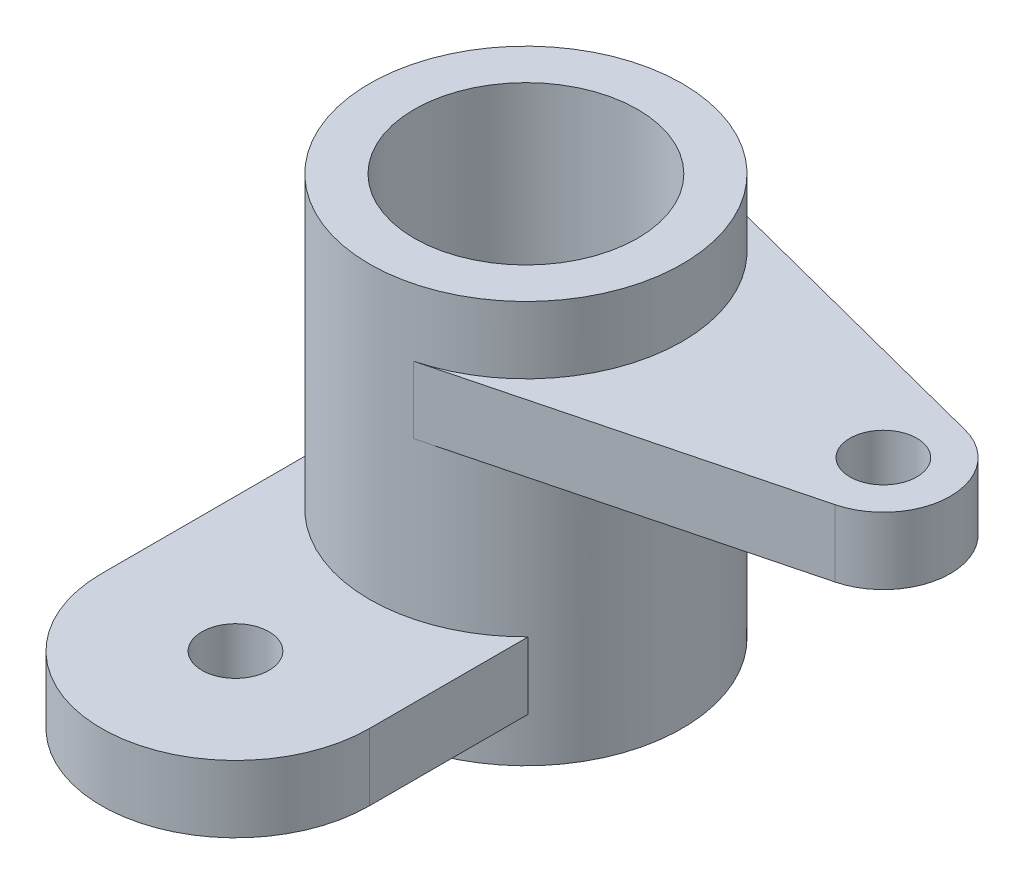
ISO-10303-21;
HEADER;
FILE_DESCRIPTION(('STEP AP214'),'2;1');
FILE_NAME('part.step','',(''),(''),'','','');
FILE_SCHEMA(('AUTOMOTIVE_DESIGN { 1 0 10303 214 1 1 1 1 }'));
ENDSEC;
DATA;
#1=APPLICATION_CONTEXT('core data for automotive mechanical design processes');
#2=APPLICATION_PROTOCOL_DEFINITION('international standard','automotive_design',2000,#1);
#3=PRODUCT_CONTEXT('',#1,'mechanical');
#4=PRODUCT('Part','Part','',(#3));
#5=PRODUCT_RELATED_PRODUCT_CATEGORY('part','',(#4));
#6=PRODUCT_DEFINITION_FORMATION('','',#4);
#7=PRODUCT_DEFINITION_CONTEXT('part definition',#1,'design');
#8=PRODUCT_DEFINITION('design','',#6,#7);
#9=PRODUCT_DEFINITION_SHAPE('','',#8);
#10=(LENGTH_UNIT() NAMED_UNIT(*) SI_UNIT(.MILLI.,.METRE.));
#11=(NAMED_UNIT(*) PLANE_ANGLE_UNIT() SI_UNIT($,.RADIAN.));
#12=(NAMED_UNIT(*) SI_UNIT($,.STERADIAN.) SOLID_ANGLE_UNIT());
#13=UNCERTAINTY_MEASURE_WITH_UNIT(LENGTH_MEASURE(1.E-05),#10,'distance_accuracy_value','');
#14=(GEOMETRIC_REPRESENTATION_CONTEXT(3) GLOBAL_UNCERTAINTY_ASSIGNED_CONTEXT((#13)) GLOBAL_UNIT_ASSIGNED_CONTEXT((#10,
#11,#12)) REPRESENTATION_CONTEXT('',''));
#15=CARTESIAN_POINT('',(0.,0.,0.));
#16=DIRECTION('',(0.,0.,1.));
#17=DIRECTION('',(1.,0.,0.));
#18=AXIS2_PLACEMENT_3D('',#15,#16,#17);
#19=CARTESIAN_POINT('',(0.,-90.,0.));
#20=DIRECTION('',(0.,1.,0.));
#21=DIRECTION('',(0.,0.,1.));
#22=AXIS2_PLACEMENT_3D('',#19,#20,#21);
#23=CYLINDRICAL_SURFACE('',#22,35.);
#24=CARTESIAN_POINT('',(0.,-90.,0.));
#25=DIRECTION('',(0.,1.,0.));
#26=DIRECTION('',(0.,0.,1.));
#27=AXIS2_PLACEMENT_3D('',#24,#25,#26);
#28=CIRCLE('',#27,35.);
#29=CARTESIAN_POINT('',(0.,-90.,35.));
#30=VERTEX_POINT('',#29);
#31=EDGE_CURVE('E11',#30,#30,#28,.T.);
#32=ORIENTED_EDGE('',*,*,#31,.T.);
#33=EDGE_LOOP('',(#32));
#34=FACE_BOUND('',#33,.T.);
#35=CARTESIAN_POINT('',(0.,0.,0.));
#36=DIRECTION('',(0.,1.,0.));
#37=DIRECTION('',(0.,0.,1.));
#38=AXIS2_PLACEMENT_3D('',#35,#36,#37);
#39=CIRCLE('',#38,35.);
#40=CARTESIAN_POINT('',(0.,0.,35.));
#41=VERTEX_POINT('',#40);
#42=EDGE_CURVE('E45',#41,#41,#39,.T.);
#43=ORIENTED_EDGE('',*,*,#42,.F.);
#44=EDGE_LOOP('',(#43));
#45=FACE_BOUND('',#44,.T.);
#46=DIRECTION('',(0.,1.,0.));
#47=VECTOR('',#46,1.);
#48=CARTESIAN_POINT('',(25.,-80.,24.4948974278318));
#49=LINE('',#48,#47);
#50=CARTESIAN_POINT('',(25.,-80.,24.4948974278318));
#51=VERTEX_POINT('',#50);
#52=CARTESIAN_POINT('',(25.,-65.,24.4948974278318));
#53=VERTEX_POINT('',#52);
#54=EDGE_CURVE('E183',#51,#53,#49,.T.);
#55=ORIENTED_EDGE('',*,*,#54,.F.);
#56=CARTESIAN_POINT('',(0.,-80.,0.));
#57=DIRECTION('',(0.,1.,0.));
#58=DIRECTION('',(0.,0.,1.));
#59=AXIS2_PLACEMENT_3D('',#56,#57,#58);
#60=CIRCLE('',#59,35.);
#61=CARTESIAN_POINT('',(-35.,-80.,0.));
#62=VERTEX_POINT('',#61);
#63=EDGE_CURVE('E164',#62,#51,#60,.T.);
#64=ORIENTED_EDGE('',*,*,#63,.F.);
#65=DIRECTION('',(0.,1.,0.));
#66=VECTOR('',#65,1.);
#67=CARTESIAN_POINT('',(-35.,-80.,0.));
#68=LINE('',#67,#66);
#69=CARTESIAN_POINT('',(-35.,-65.,0.));
#70=VERTEX_POINT('',#69);
#71=EDGE_CURVE('E180',#62,#70,#68,.T.);
#72=ORIENTED_EDGE('',*,*,#71,.T.);
#73=CARTESIAN_POINT('',(0.,-65.,0.));
#74=DIRECTION('',(0.,1.,0.));
#75=DIRECTION('',(0.,0.,1.));
#76=AXIS2_PLACEMENT_3D('',#73,#74,#75);
#77=CIRCLE('',#76,35.);
#78=EDGE_CURVE('E155',#70,#53,#77,.T.);
#79=ORIENTED_EDGE('',*,*,#78,.T.);
#80=EDGE_LOOP('',(#55,#64,#72,#79));
#81=FACE_BOUND('',#80,.T.);
#82=DIRECTION('',(0.,1.,0.));
#83=VECTOR('',#82,1.);
#84=CARTESIAN_POINT('',(8.75000000000001,-30.,-33.8886042793149));
#85=LINE('',#84,#83);
#86=CARTESIAN_POINT('',(8.75000000000001,-30.,-33.8886042793149));
#87=VERTEX_POINT('',#86);
#88=CARTESIAN_POINT('',(8.75000000000001,-15.,-33.8886042793149));
#89=VERTEX_POINT('',#88);
#90=EDGE_CURVE('E58',#87,#89,#85,.T.);
#91=ORIENTED_EDGE('',*,*,#90,.F.);
#92=CARTESIAN_POINT('',(0.,-30.,0.));
#93=DIRECTION('',(0.,1.,0.));
#94=DIRECTION('',(0.,0.,1.));
#95=AXIS2_PLACEMENT_3D('',#92,#93,#94);
#96=CIRCLE('',#95,35.);
#97=CARTESIAN_POINT('',(8.75000000000001,-30.,33.8886042793149));
#98=VERTEX_POINT('',#97);
#99=EDGE_CURVE('E63',#98,#87,#96,.T.);
#100=ORIENTED_EDGE('',*,*,#99,.F.);
#101=DIRECTION('',(0.,1.,0.));
#102=VECTOR('',#101,1.);
#103=CARTESIAN_POINT('',(8.75,-30.,33.8886042793149));
#104=LINE('',#103,#102);
#105=CARTESIAN_POINT('',(8.75,-15.,33.8886042793149));
#106=VERTEX_POINT('',#105);
#107=EDGE_CURVE('E118',#98,#106,#104,.T.);
#108=ORIENTED_EDGE('',*,*,#107,.T.);
#109=CARTESIAN_POINT('',(0.,-15.,0.));
#110=DIRECTION('',(0.,1.,0.));
#111=DIRECTION('',(0.,0.,1.));
#112=AXIS2_PLACEMENT_3D('',#109,#110,#111);
#113=CIRCLE('',#112,35.);
#114=EDGE_CURVE('E137',#106,#89,#113,.T.);
#115=ORIENTED_EDGE('',*,*,#114,.T.);
#116=EDGE_LOOP('',(#91,#100,#108,#115));
#117=FACE_BOUND('',#116,.T.);
#118=ADVANCED_FACE('F41',(#34,#45,#81,#117),#23,.T.);
#119=CARTESIAN_POINT('',(0.,-90.,0.));
#120=DIRECTION('',(0.,1.,0.));
#121=DIRECTION('',(0.,0.,1.));
#122=AXIS2_PLACEMENT_3D('',#119,#120,#121);
#123=CYLINDRICAL_SURFACE('',#122,25.);
#124=CARTESIAN_POINT('',(0.,-90.,0.));
#125=DIRECTION('',(0.,1.,0.));
#126=DIRECTION('',(0.,0.,1.));
#127=AXIS2_PLACEMENT_3D('',#124,#125,#126);
#128=CIRCLE('',#127,25.);
#129=CARTESIAN_POINT('',(0.,-90.,25.));
#130=VERTEX_POINT('',#129);
#131=EDGE_CURVE('E50',#130,#130,#128,.T.);
#132=CARTESIAN_POINT('',(0.,0.,0.));
#133=DIRECTION('',(0.,1.,0.));
#134=DIRECTION('',(0.,0.,1.));
#135=AXIS2_PLACEMENT_3D('',#132,#133,#134);
#136=CIRCLE('',#135,25.);
#137=CARTESIAN_POINT('',(0.,0.,25.));
#138=VERTEX_POINT('',#137);
#139=EDGE_CURVE('E182',#138,#138,#136,.T.);
#140=CARTESIAN_POINT('',(0.,-90.,25.));
#141=CARTESIAN_POINT('',(0.,-89.0625,25.));
#142=CARTESIAN_POINT('',(0.,-88.125,25.));
#143=CARTESIAN_POINT('',(0.,-86.25,25.));
#144=CARTESIAN_POINT('',(0.,-85.3125,25.));
#145=CARTESIAN_POINT('',(0.,-83.4375,25.));
#146=CARTESIAN_POINT('',(0.,-82.5,25.));
#147=CARTESIAN_POINT('',(0.,-80.625,25.));
#148=CARTESIAN_POINT('',(0.,-79.6875,25.));
#149=CARTESIAN_POINT('',(0.,-77.8125,25.));
#150=CARTESIAN_POINT('',(0.,-76.875,25.));
#151=CARTESIAN_POINT('',(0.,-75.,25.));
#152=CARTESIAN_POINT('',(0.,-74.0625,25.));
#153=CARTESIAN_POINT('',(0.,-72.1875,25.));
#154=CARTESIAN_POINT('',(0.,-71.25,25.));
#155=CARTESIAN_POINT('',(0.,-69.375,25.));
#156=CARTESIAN_POINT('',(0.,-68.4375,25.));
#157=CARTESIAN_POINT('',(0.,-66.5625,25.));
#158=CARTESIAN_POINT('',(0.,-65.625,25.));
#159=CARTESIAN_POINT('',(0.,-63.75,25.));
#160=CARTESIAN_POINT('',(0.,-62.8125,25.));
#161=CARTESIAN_POINT('',(0.,-60.9375,25.));
#162=CARTESIAN_POINT('',(0.,-60.,25.));
#163=CARTESIAN_POINT('',(0.,-58.125,25.));
#164=CARTESIAN_POINT('',(0.,-57.1875,25.));
#165=CARTESIAN_POINT('',(0.,-55.3125,25.));
#166=CARTESIAN_POINT('',(0.,-54.375,25.));
#167=CARTESIAN_POINT('',(0.,-52.5,25.));
#168=CARTESIAN_POINT('',(0.,-51.5625,25.));
#169=CARTESIAN_POINT('',(0.,-49.6875,25.));
#170=CARTESIAN_POINT('',(0.,-48.75,25.));
#171=CARTESIAN_POINT('',(0.,-46.875,25.));
#172=CARTESIAN_POINT('',(0.,-45.9375,25.));
#173=CARTESIAN_POINT('',(0.,-44.0625,25.));
#174=CARTESIAN_POINT('',(0.,-43.125,25.));
#175=CARTESIAN_POINT('',(0.,-41.25,25.));
#176=CARTESIAN_POINT('',(0.,-40.3125,25.));
#177=CARTESIAN_POINT('',(0.,-38.4375,25.));
#178=CARTESIAN_POINT('',(0.,-37.5,25.));
#179=CARTESIAN_POINT('',(0.,-35.625,25.));
#180=CARTESIAN_POINT('',(0.,-34.6875,25.));
#181=CARTESIAN_POINT('',(0.,-32.8125,25.));
#182=CARTESIAN_POINT('',(0.,-31.875,25.));
#183=CARTESIAN_POINT('',(0.,-30.,25.));
#184=CARTESIAN_POINT('',(0.,-29.0625,25.));
#185=CARTESIAN_POINT('',(0.,-27.1875,25.));
#186=CARTESIAN_POINT('',(0.,-26.25,25.));
#187=CARTESIAN_POINT('',(0.,-24.375,25.));
#188=CARTESIAN_POINT('',(0.,-23.4375,25.));
#189=CARTESIAN_POINT('',(0.,-21.5625,25.));
#190=CARTESIAN_POINT('',(0.,-20.625,25.));
#191=CARTESIAN_POINT('',(0.,-18.75,25.));
#192=CARTESIAN_POINT('',(0.,-17.8125,25.));
#193=CARTESIAN_POINT('',(0.,-15.9375,25.));
#194=CARTESIAN_POINT('',(0.,-15.,25.));
#195=CARTESIAN_POINT('',(0.,-13.125,25.));
#196=CARTESIAN_POINT('',(0.,-12.1875,25.));
#197=CARTESIAN_POINT('',(0.,-10.3125,25.));
#198=CARTESIAN_POINT('',(0.,-9.37500000000001,25.));
#199=CARTESIAN_POINT('',(0.,-7.50000000000002,25.));
#200=CARTESIAN_POINT('',(0.,-6.56250000000002,25.));
#201=CARTESIAN_POINT('',(0.,-4.68750000000002,25.));
#202=CARTESIAN_POINT('',(0.,-3.75000000000001,25.));
#203=CARTESIAN_POINT('',(0.,-1.87500000000001,25.));
#204=CARTESIAN_POINT('',(0.,-0.937500000000014,25.));
#205=CARTESIAN_POINT('',(0.,0.,25.));
#206=B_SPLINE_CURVE_WITH_KNOTS('',3,(#140,#141,#142,#143,#144,#145,#146,#147,#148,#149,#150,
#151,#152,#153,#154,#155,#156,#157,#158,#159,#160,#161,#162,#163,#164,#165,#166,#167,#168,#169,
#170,#171,#172,#173,#174,#175,#176,#177,#178,#179,#180,#181,#182,#183,#184,#185,#186,#187,#188,
#189,#190,#191,#192,#193,#194,#195,#196,#197,#198,#199,#200,#201,#202,#203,#204,#205),
.UNSPECIFIED.,.F.,.F.,(4,2,2,2,2,2,2,2,2,2,2,2,2,2,2,2,2,2,2,2,2,2,2,2,2,2,2,2,2,2,2,2,4),(0.,
2.81250000000001,5.62500000000001,8.4375,11.25,14.0625,16.875,19.6875,22.5,25.3125,28.125,
30.9375,33.75,36.5625,39.375,42.1875,45.,47.8125,50.625,53.4375,56.25,59.0625,61.875,64.6875,
67.5,70.3125,73.125,75.9375,78.75,81.5625,84.375,87.1875,90.),.UNSPECIFIED.);
#207=EDGE_CURVE('BSEAM43',#130,#138,#206,.T.);
#208=ORIENTED_EDGE('',*,*,#131,.F.);
#209=ORIENTED_EDGE('',*,*,#139,.T.);
#210=ORIENTED_EDGE('',*,*,#207,.T.);
#211=ORIENTED_EDGE('',*,*,#207,.F.);
#212=EDGE_LOOP('',(#208,#210,#209,#211));
#213=FACE_BOUND('',#212,.T.);
#214=ADVANCED_FACE('F43',(#213),#123,.F.);
#215=CARTESIAN_POINT('',(0.,-90.,0.));
#216=DIRECTION('',(0.,1.,0.));
#217=DIRECTION('',(0.,0.,1.));
#218=AXIS2_PLACEMENT_3D('',#215,#216,#217);
#219=PLANE('',#218);
#220=ORIENTED_EDGE('',*,*,#131,.T.);
#221=EDGE_LOOP('',(#220));
#222=FACE_BOUND('',#221,.T.);
#223=ORIENTED_EDGE('',*,*,#31,.F.);
#224=EDGE_LOOP('',(#223));
#225=FACE_BOUND('',#224,.T.);
#226=ADVANCED_FACE('F244',(#222,#225),#219,.F.);
#227=CARTESIAN_POINT('',(0.,0.,0.));
#228=DIRECTION('',(0.,1.,0.));
#229=DIRECTION('',(0.,0.,1.));
#230=AXIS2_PLACEMENT_3D('',#227,#228,#229);
#231=PLANE('',#230);
#232=ORIENTED_EDGE('',*,*,#139,.F.);
#233=EDGE_LOOP('',(#232));
#234=FACE_BOUND('',#233,.T.);
#235=ORIENTED_EDGE('',*,*,#42,.T.);
#236=EDGE_LOOP('',(#235));
#237=FACE_BOUND('',#236,.T.);
#238=ADVANCED_FACE('F196',(#234,#237),#231,.T.);
#239=CARTESIAN_POINT('',(-35.,-80.,0.));
#240=DIRECTION('',(-1.,0.,0.));
#241=DIRECTION('',(0.,0.,1.));
#242=AXIS2_PLACEMENT_3D('',#239,#240,#241);
#243=PLANE('',#242);
#244=DIRECTION('',(0.,0.,1.));
#245=VECTOR('',#244,1.);
#246=CARTESIAN_POINT('',(-35.,-65.,0.));
#247=LINE('',#246,#245);
#248=CARTESIAN_POINT('',(-35.,-65.,60.));
#249=VERTEX_POINT('',#248);
#250=EDGE_CURVE('E170',#70,#249,#247,.T.);
#251=ORIENTED_EDGE('',*,*,#250,.F.);
#252=ORIENTED_EDGE('',*,*,#71,.F.);
#253=DIRECTION('',(0.,0.,1.));
#254=VECTOR('',#253,1.);
#255=CARTESIAN_POINT('',(-35.,-80.,0.));
#256=LINE('',#255,#254);
#257=CARTESIAN_POINT('',(-35.,-80.,60.));
#258=VERTEX_POINT('',#257);
#259=EDGE_CURVE('E154',#62,#258,#256,.T.);
#260=ORIENTED_EDGE('',*,*,#259,.T.);
#261=DIRECTION('',(0.,1.,0.));
#262=VECTOR('',#261,1.);
#263=CARTESIAN_POINT('',(-35.,-80.,60.));
#264=LINE('',#263,#262);
#265=EDGE_CURVE('E167',#258,#249,#264,.T.);
#266=ORIENTED_EDGE('',*,*,#265,.T.);
#267=EDGE_LOOP('',(#251,#252,#260,#266));
#268=FACE_BOUND('',#267,.T.);
#269=ADVANCED_FACE('F216',(#268),#243,.T.);
#270=CARTESIAN_POINT('',(25.,-80.,0.));
#271=DIRECTION('',(1.,0.,0.));
#272=DIRECTION('',(0.,0.,-1.));
#273=AXIS2_PLACEMENT_3D('',#270,#271,#272);
#274=PLANE('',#273);
#275=DIRECTION('',(0.,0.,-1.));
#276=VECTOR('',#275,1.);
#277=CARTESIAN_POINT('',(25.,-65.,0.));
#278=LINE('',#277,#276);
#279=CARTESIAN_POINT('',(25.,-65.,60.));
#280=VERTEX_POINT('',#279);
#281=EDGE_CURVE('E176',#280,#53,#278,.T.);
#282=ORIENTED_EDGE('',*,*,#281,.F.);
#283=DIRECTION('',(0.,1.,0.));
#284=VECTOR('',#283,1.);
#285=CARTESIAN_POINT('',(25.,-80.,60.));
#286=LINE('',#285,#284);
#287=CARTESIAN_POINT('',(25.,-80.,60.));
#288=VERTEX_POINT('',#287);
#289=EDGE_CURVE('E186',#288,#280,#286,.T.);
#290=ORIENTED_EDGE('',*,*,#289,.F.);
#291=DIRECTION('',(0.,0.,-1.));
#292=VECTOR('',#291,1.);
#293=CARTESIAN_POINT('',(25.,-80.,0.));
#294=LINE('',#293,#292);
#295=EDGE_CURVE('E161',#288,#51,#294,.T.);
#296=ORIENTED_EDGE('',*,*,#295,.T.);
#297=ORIENTED_EDGE('',*,*,#54,.T.);
#298=EDGE_LOOP('',(#282,#290,#296,#297));
#299=FACE_BOUND('',#298,.T.);
#300=ADVANCED_FACE('F210',(#299),#274,.T.);
#301=CARTESIAN_POINT('',(-5.00000000000001,-80.,60.));
#302=DIRECTION('',(0.,1.,0.));
#303=DIRECTION('',(0.,0.,1.));
#304=AXIS2_PLACEMENT_3D('',#301,#302,#303);
#305=CYLINDRICAL_SURFACE('',#304,7.5);
#306=CARTESIAN_POINT('',(-5.00000000000001,-80.,60.));
#307=DIRECTION('',(0.,1.,0.));
#308=DIRECTION('',(0.,0.,1.));
#309=AXIS2_PLACEMENT_3D('',#306,#307,#308);
#310=CIRCLE('',#309,7.5);
#311=CARTESIAN_POINT('',(-5.00000000000001,-80.,67.5));
#312=VERTEX_POINT('',#311);
#313=EDGE_CURVE('E151',#312,#312,#310,.T.);
#314=ORIENTED_EDGE('',*,*,#313,.F.);
#315=EDGE_LOOP('',(#314));
#316=FACE_BOUND('',#315,.T.);
#317=CARTESIAN_POINT('',(-5.00000000000001,-65.,60.));
#318=DIRECTION('',(0.,1.,0.));
#319=DIRECTION('',(0.,0.,1.));
#320=AXIS2_PLACEMENT_3D('',#317,#318,#319);
#321=CIRCLE('',#320,7.5);
#322=CARTESIAN_POINT('',(-5.00000000000001,-65.,67.5));
#323=VERTEX_POINT('',#322);
#324=EDGE_CURVE('E148',#323,#323,#321,.T.);
#325=ORIENTED_EDGE('',*,*,#324,.T.);
#326=EDGE_LOOP('',(#325));
#327=FACE_BOUND('',#326,.T.);
#328=ADVANCED_FACE('F236',(#316,#327),#305,.F.);
#329=CARTESIAN_POINT('',(-5.00000000000001,-80.,60.));
#330=DIRECTION('',(0.,1.,0.));
#331=DIRECTION('',(0.,0.,1.));
#332=AXIS2_PLACEMENT_3D('',#329,#330,#331);
#333=CYLINDRICAL_SURFACE('',#332,30.);
#334=CARTESIAN_POINT('',(-5.00000000000001,-65.,60.));
#335=DIRECTION('',(0.,1.,0.));
#336=DIRECTION('',(0.,0.,1.));
#337=AXIS2_PLACEMENT_3D('',#334,#335,#336);
#338=CIRCLE('',#337,30.);
#339=EDGE_CURVE('E173',#249,#280,#338,.T.);
#340=ORIENTED_EDGE('',*,*,#339,.F.);
#341=ORIENTED_EDGE('',*,*,#265,.F.);
#342=CARTESIAN_POINT('',(-5.00000000000001,-80.,60.));
#343=DIRECTION('',(0.,1.,0.));
#344=DIRECTION('',(0.,0.,1.));
#345=AXIS2_PLACEMENT_3D('',#342,#343,#344);
#346=CIRCLE('',#345,30.);
#347=EDGE_CURVE('E158',#258,#288,#346,.T.);
#348=ORIENTED_EDGE('',*,*,#347,.T.);
#349=ORIENTED_EDGE('',*,*,#289,.T.);
#350=EDGE_LOOP('',(#340,#341,#348,#349));
#351=FACE_BOUND('',#350,.T.);
#352=ADVANCED_FACE('F213',(#351),#333,.T.);
#353=CARTESIAN_POINT('',(0.,-80.,0.));
#354=DIRECTION('',(0.,1.,0.));
#355=DIRECTION('',(0.,0.,1.));
#356=AXIS2_PLACEMENT_3D('',#353,#354,#355);
#357=PLANE('',#356);
#358=ORIENTED_EDGE('',*,*,#313,.T.);
#359=EDGE_LOOP('',(#358));
#360=FACE_BOUND('',#359,.T.);
#361=ORIENTED_EDGE('',*,*,#259,.F.);
#362=ORIENTED_EDGE('',*,*,#63,.T.);
#363=ORIENTED_EDGE('',*,*,#295,.F.);
#364=ORIENTED_EDGE('',*,*,#347,.F.);
#365=EDGE_LOOP('',(#361,#362,#363,#364));
#366=FACE_BOUND('',#365,.T.);
#367=ADVANCED_FACE('F208',(#360,#366),#357,.F.);
#368=CARTESIAN_POINT('',(0.,-65.,0.));
#369=DIRECTION('',(0.,1.,0.));
#370=DIRECTION('',(0.,0.,1.));
#371=AXIS2_PLACEMENT_3D('',#368,#369,#370);
#372=PLANE('',#371);
#373=ORIENTED_EDGE('',*,*,#324,.F.);
#374=EDGE_LOOP('',(#373));
#375=FACE_BOUND('',#374,.T.);
#376=ORIENTED_EDGE('',*,*,#250,.T.);
#377=ORIENTED_EDGE('',*,*,#339,.T.);
#378=ORIENTED_EDGE('',*,*,#281,.T.);
#379=ORIENTED_EDGE('',*,*,#78,.F.);
#380=EDGE_LOOP('',(#376,#377,#378,#379));
#381=FACE_BOUND('',#380,.T.);
#382=ADVANCED_FACE('F218',(#375,#381),#372,.T.);
#383=CARTESIAN_POINT('',(8.75000000000001,-30.,-33.8886042793149));
#384=DIRECTION('',(-0.25,0.,0.968245836551854));
#385=DIRECTION('',(0.968245836551854,0.,0.25));
#386=AXIS2_PLACEMENT_3D('',#383,#384,#385);
#387=PLANE('',#386);
#388=DIRECTION('',(0.968245836551854,0.,0.25));
#389=VECTOR('',#388,1.);
#390=CARTESIAN_POINT('',(8.75000000000001,-15.,-33.8886042793149));
#391=LINE('',#390,#389);
#392=CARTESIAN_POINT('',(83.75,-15.,-14.5236875482778));
#393=VERTEX_POINT('',#392);
#394=EDGE_CURVE('E142',#89,#393,#391,.T.);
#395=ORIENTED_EDGE('',*,*,#394,.T.);
#396=DIRECTION('',(0.,1.,0.));
#397=VECTOR('',#396,1.);
#398=CARTESIAN_POINT('',(83.75,-30.,-14.5236875482778));
#399=LINE('',#398,#397);
#400=CARTESIAN_POINT('',(83.75,-30.,-14.5236875482778));
#401=VERTEX_POINT('',#400);
#402=EDGE_CURVE('E117',#401,#393,#399,.T.);
#403=ORIENTED_EDGE('',*,*,#402,.F.);
#404=DIRECTION('',(0.968245836551854,0.,0.25));
#405=VECTOR('',#404,1.);
#406=CARTESIAN_POINT('',(8.75000000000001,-30.,-33.8886042793149));
#407=LINE('',#406,#405);
#408=EDGE_CURVE('E125',#87,#401,#407,.T.);
#409=ORIENTED_EDGE('',*,*,#408,.F.);
#410=ORIENTED_EDGE('',*,*,#90,.T.);
#411=EDGE_LOOP('',(#395,#403,#409,#410));
#412=FACE_BOUND('',#411,.T.);
#413=ADVANCED_FACE('F220',(#412),#387,.F.);
#414=CARTESIAN_POINT('',(80.,-30.,0.));
#415=DIRECTION('',(0.,1.,0.));
#416=DIRECTION('',(0.,0.,1.));
#417=AXIS2_PLACEMENT_3D('',#414,#415,#416);
#418=CYLINDRICAL_SURFACE('',#417,15.);
#419=CARTESIAN_POINT('',(80.,-15.,0.));
#420=DIRECTION('',(0.,1.,0.));
#421=DIRECTION('',(0.,0.,1.));
#422=AXIS2_PLACEMENT_3D('',#419,#420,#421);
#423=CIRCLE('',#422,15.);
#424=CARTESIAN_POINT('',(83.75,-15.,14.5236875482778));
#425=VERTEX_POINT('',#424);
#426=EDGE_CURVE('E112',#425,#393,#423,.T.);
#427=ORIENTED_EDGE('',*,*,#426,.F.);
#428=DIRECTION('',(0.,1.,0.));
#429=VECTOR('',#428,1.);
#430=CARTESIAN_POINT('',(83.75,-30.,14.5236875482778));
#431=LINE('',#430,#429);
#432=CARTESIAN_POINT('',(83.75,-30.,14.5236875482778));
#433=VERTEX_POINT('',#432);
#434=EDGE_CURVE('E107',#433,#425,#431,.T.);
#435=ORIENTED_EDGE('',*,*,#434,.F.);
#436=CARTESIAN_POINT('',(80.,-30.,0.));
#437=DIRECTION('',(0.,1.,0.));
#438=DIRECTION('',(0.,0.,1.));
#439=AXIS2_PLACEMENT_3D('',#436,#437,#438);
#440=CIRCLE('',#439,15.);
#441=EDGE_CURVE('E110',#433,#401,#440,.T.);
#442=ORIENTED_EDGE('',*,*,#441,.T.);
#443=ORIENTED_EDGE('',*,*,#402,.T.);
#444=EDGE_LOOP('',(#427,#435,#442,#443));
#445=FACE_BOUND('',#444,.T.);
#446=ADVANCED_FACE('F109',(#445),#418,.T.);
#447=CARTESIAN_POINT('',(8.75000000000001,-30.,33.8886042793149));
#448=DIRECTION('',(0.25,0.,0.968245836551854));
#449=DIRECTION('',(0.968245836551854,0.,-0.25));
#450=AXIS2_PLACEMENT_3D('',#447,#448,#449);
#451=PLANE('',#450);
#452=DIRECTION('',(0.968245836551854,0.,-0.25));
#453=VECTOR('',#452,1.);
#454=CARTESIAN_POINT('',(8.75000000000001,-15.,33.8886042793149));
#455=LINE('',#454,#453);
#456=EDGE_CURVE('E139',#106,#425,#455,.T.);
#457=ORIENTED_EDGE('',*,*,#456,.F.);
#458=ORIENTED_EDGE('',*,*,#107,.F.);
#459=DIRECTION('',(0.968245836551854,0.,-0.25));
#460=VECTOR('',#459,1.);
#461=CARTESIAN_POINT('',(8.75000000000001,-30.,33.8886042793149));
#462=LINE('',#461,#460);
#463=EDGE_CURVE('E124',#98,#433,#462,.T.);
#464=ORIENTED_EDGE('',*,*,#463,.T.);
#465=ORIENTED_EDGE('',*,*,#434,.T.);
#466=EDGE_LOOP('',(#457,#458,#464,#465));
#467=FACE_BOUND('',#466,.T.);
#468=ADVANCED_FACE('F128',(#467),#451,.T.);
#469=CARTESIAN_POINT('',(80.,-30.,0.));
#470=DIRECTION('',(0.,1.,0.));
#471=DIRECTION('',(0.,0.,1.));
#472=AXIS2_PLACEMENT_3D('',#469,#470,#471);
#473=CYLINDRICAL_SURFACE('',#472,7.5);
#474=CARTESIAN_POINT('',(80.,-30.,0.));
#475=DIRECTION('',(0.,1.,0.));
#476=DIRECTION('',(0.,0.,1.));
#477=AXIS2_PLACEMENT_3D('',#474,#475,#476);
#478=CIRCLE('',#477,7.5);
#479=CARTESIAN_POINT('',(80.,-30.,7.5));
#480=VERTEX_POINT('',#479);
#481=EDGE_CURVE('E134',#480,#480,#478,.T.);
#482=ORIENTED_EDGE('',*,*,#481,.F.);
#483=EDGE_LOOP('',(#482));
#484=FACE_BOUND('',#483,.T.);
#485=CARTESIAN_POINT('',(80.,-15.,0.));
#486=DIRECTION('',(0.,1.,0.));
#487=DIRECTION('',(0.,0.,1.));
#488=AXIS2_PLACEMENT_3D('',#485,#486,#487);
#489=CIRCLE('',#488,7.5);
#490=CARTESIAN_POINT('',(80.,-15.,7.5));
#491=VERTEX_POINT('',#490);
#492=EDGE_CURVE('E130',#491,#491,#489,.T.);
#493=ORIENTED_EDGE('',*,*,#492,.T.);
#494=EDGE_LOOP('',(#493));
#495=FACE_BOUND('',#494,.T.);
#496=ADVANCED_FACE('F313',(#484,#495),#473,.F.);
#497=CARTESIAN_POINT('',(0.,-30.,0.));
#498=DIRECTION('',(0.,1.,0.));
#499=DIRECTION('',(0.,0.,1.));
#500=AXIS2_PLACEMENT_3D('',#497,#498,#499);
#501=PLANE('',#500);
#502=ORIENTED_EDGE('',*,*,#99,.T.);
#503=ORIENTED_EDGE('',*,*,#408,.T.);
#504=ORIENTED_EDGE('',*,*,#441,.F.);
#505=ORIENTED_EDGE('',*,*,#463,.F.);
#506=EDGE_LOOP('',(#502,#503,#504,#505));
#507=FACE_BOUND('',#506,.T.);
#508=ORIENTED_EDGE('',*,*,#481,.T.);
#509=EDGE_LOOP('',(#508));
#510=FACE_BOUND('',#509,.T.);
#511=ADVANCED_FACE('F122',(#507,#510),#501,.F.);
#512=CARTESIAN_POINT('',(0.,-15.,0.));
#513=DIRECTION('',(0.,1.,0.));
#514=DIRECTION('',(0.,0.,1.));
#515=AXIS2_PLACEMENT_3D('',#512,#513,#514);
#516=PLANE('',#515);
#517=ORIENTED_EDGE('',*,*,#114,.F.);
#518=ORIENTED_EDGE('',*,*,#456,.T.);
#519=ORIENTED_EDGE('',*,*,#426,.T.);
#520=ORIENTED_EDGE('',*,*,#394,.F.);
#521=EDGE_LOOP('',(#517,#518,#519,#520));
#522=FACE_BOUND('',#521,.T.);
#523=ORIENTED_EDGE('',*,*,#492,.F.);
#524=EDGE_LOOP('',(#523));
#525=FACE_BOUND('',#524,.T.);
#526=ADVANCED_FACE('F333',(#522,#525),#516,.T.);
#527=CLOSED_SHELL('',(#118,#214,#226,#238,#269,#300,#328,#352,#367,#382,#413,#446,#468,#496,
#511,#526));
#528=MANIFOLD_SOLID_BREP('B2',#527);
#529=ADVANCED_BREP_SHAPE_REPRESENTATION('',(#18,#528),#14);
#530=SHAPE_DEFINITION_REPRESENTATION(#9,#529);
ENDSEC;
END-ISO-10303-21;
